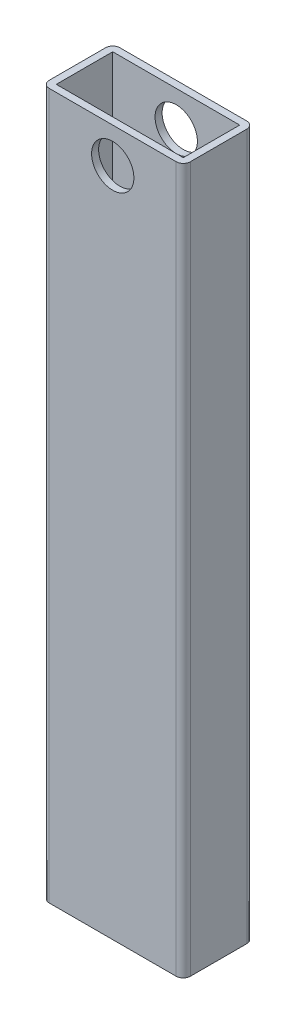
ISO-10303-21;
HEADER;
FILE_DESCRIPTION(('STEP AP214'),'2;1');
FILE_NAME('part.step','',(''),(''),'','','');
FILE_SCHEMA(('AUTOMOTIVE_DESIGN { 1 0 10303 214 1 1 1 1 }'));
ENDSEC;
DATA;
#1=APPLICATION_CONTEXT('core data for automotive mechanical design processes');
#2=APPLICATION_PROTOCOL_DEFINITION('international standard','automotive_design',2000,#1);
#3=PRODUCT_CONTEXT('',#1,'mechanical');
#4=PRODUCT('Part','Part','',(#3));
#5=PRODUCT_RELATED_PRODUCT_CATEGORY('part','',(#4));
#6=PRODUCT_DEFINITION_FORMATION('','',#4);
#7=PRODUCT_DEFINITION_CONTEXT('part definition',#1,'design');
#8=PRODUCT_DEFINITION('design','',#6,#7);
#9=PRODUCT_DEFINITION_SHAPE('','',#8);
#10=(LENGTH_UNIT() NAMED_UNIT(*) SI_UNIT(.MILLI.,.METRE.));
#11=(NAMED_UNIT(*) PLANE_ANGLE_UNIT() SI_UNIT($,.RADIAN.));
#12=(NAMED_UNIT(*) SI_UNIT($,.STERADIAN.) SOLID_ANGLE_UNIT());
#13=UNCERTAINTY_MEASURE_WITH_UNIT(LENGTH_MEASURE(1.E-05),#10,'distance_accuracy_value','');
#14=(GEOMETRIC_REPRESENTATION_CONTEXT(3) GLOBAL_UNCERTAINTY_ASSIGNED_CONTEXT((#13)) GLOBAL_UNIT_ASSIGNED_CONTEXT((#10,
#11,#12)) REPRESENTATION_CONTEXT('',''));
#15=CARTESIAN_POINT('',(0.,0.,0.));
#16=DIRECTION('',(0.,0.,1.));
#17=DIRECTION('',(1.,0.,0.));
#18=AXIS2_PLACEMENT_3D('',#15,#16,#17);
#19=CARTESIAN_POINT('',(10.,-100.,-5.));
#20=DIRECTION('',(1.,0.,0.));
#21=DIRECTION('',(0.,0.,-1.));
#22=AXIS2_PLACEMENT_3D('',#19,#20,#21);
#23=PLANE('',#22);
#24=DIRECTION('',(0.,0.,-1.));
#25=VECTOR('',#24,1.);
#26=CARTESIAN_POINT('',(10.,-100.,-5.));
#27=LINE('',#26,#25);
#28=CARTESIAN_POINT('',(10.,-100.,4.));
#29=VERTEX_POINT('',#28);
#30=CARTESIAN_POINT('',(10.,-100.,-4.));
#31=VERTEX_POINT('',#30);
#32=EDGE_CURVE('E194',#29,#31,#27,.T.);
#33=ORIENTED_EDGE('',*,*,#32,.T.);
#34=DIRECTION('',(0.,1.,0.));
#35=VECTOR('',#34,1.);
#36=CARTESIAN_POINT('',(10.,-100.,-4.));
#37=LINE('',#36,#35);
#38=CARTESIAN_POINT('',(10.,0.,-4.));
#39=VERTEX_POINT('',#38);
#40=EDGE_CURVE('E247',#31,#39,#37,.T.);
#41=ORIENTED_EDGE('',*,*,#40,.T.);
#42=DIRECTION('',(0.,0.,-1.));
#43=VECTOR('',#42,1.);
#44=CARTESIAN_POINT('',(10.,0.,-5.));
#45=LINE('',#44,#43);
#46=CARTESIAN_POINT('',(10.,0.,4.));
#47=VERTEX_POINT('',#46);
#48=EDGE_CURVE('E190',#47,#39,#45,.T.);
#49=ORIENTED_EDGE('',*,*,#48,.F.);
#50=DIRECTION('',(0.,1.,0.));
#51=VECTOR('',#50,1.);
#52=CARTESIAN_POINT('',(10.,-100.,4.));
#53=LINE('',#52,#51);
#54=EDGE_CURVE('E245',#47,#29,#53,.F.);
#55=ORIENTED_EDGE('',*,*,#54,.T.);
#56=EDGE_LOOP('',(#33,#41,#49,#55));
#57=FACE_BOUND('',#56,.T.);
#58=ADVANCED_FACE('F59',(#57),#23,.T.);
#59=CARTESIAN_POINT('',(-10.,-100.,5.));
#60=DIRECTION('',(0.,0.,1.));
#61=DIRECTION('',(1.,0.,0.));
#62=AXIS2_PLACEMENT_3D('',#59,#60,#61);
#63=PLANE('',#62);
#64=CARTESIAN_POINT('',(0.,-5.,5.));
#65=DIRECTION('',(0.,0.,1.));
#66=DIRECTION('',(1.,0.,0.));
#67=AXIS2_PLACEMENT_3D('',#64,#65,#66);
#68=CIRCLE('',#67,3.);
#69=CARTESIAN_POINT('',(3.,-5.,5.));
#70=VERTEX_POINT('',#69);
#71=EDGE_CURVE('E419',#70,#70,#68,.T.);
#72=ORIENTED_EDGE('',*,*,#71,.F.);
#73=EDGE_LOOP('',(#72));
#74=FACE_BOUND('',#73,.T.);
#75=DIRECTION('',(1.,0.,0.));
#76=VECTOR('',#75,1.);
#77=CARTESIAN_POINT('',(-10.,0.,5.));
#78=LINE('',#77,#76);
#79=CARTESIAN_POINT('',(-9.,0.,5.));
#80=VERTEX_POINT('',#79);
#81=CARTESIAN_POINT('',(9.,0.,5.));
#82=VERTEX_POINT('',#81);
#83=EDGE_CURVE('E198',#80,#82,#78,.T.);
#84=ORIENTED_EDGE('',*,*,#83,.F.);
#85=DIRECTION('',(0.,1.,0.));
#86=VECTOR('',#85,1.);
#87=CARTESIAN_POINT('',(-9.,-100.,5.));
#88=LINE('',#87,#86);
#89=CARTESIAN_POINT('',(-9.,-100.,5.));
#90=VERTEX_POINT('',#89);
#91=EDGE_CURVE('E12',#80,#90,#88,.F.);
#92=ORIENTED_EDGE('',*,*,#91,.T.);
#93=DIRECTION('',(1.,0.,0.));
#94=VECTOR('',#93,1.);
#95=CARTESIAN_POINT('',(-10.,-100.,5.));
#96=LINE('',#95,#94);
#97=CARTESIAN_POINT('',(9.,-100.,5.));
#98=VERTEX_POINT('',#97);
#99=EDGE_CURVE('E204',#90,#98,#96,.T.);
#100=ORIENTED_EDGE('',*,*,#99,.T.);
#101=DIRECTION('',(0.,1.,0.));
#102=VECTOR('',#101,1.);
#103=CARTESIAN_POINT('',(9.,-100.,5.));
#104=LINE('',#103,#102);
#105=EDGE_CURVE('E67',#98,#82,#104,.T.);
#106=ORIENTED_EDGE('',*,*,#105,.T.);
#107=EDGE_LOOP('',(#84,#92,#100,#106));
#108=FACE_BOUND('',#107,.T.);
#109=ADVANCED_FACE('F251',(#74,#108),#63,.T.);
#110=CARTESIAN_POINT('',(-10.,-100.,-5.));
#111=DIRECTION('',(-1.,0.,0.));
#112=DIRECTION('',(0.,0.,1.));
#113=AXIS2_PLACEMENT_3D('',#110,#111,#112);
#114=PLANE('',#113);
#115=DIRECTION('',(0.,0.,1.));
#116=VECTOR('',#115,1.);
#117=CARTESIAN_POINT('',(-10.,0.,-5.));
#118=LINE('',#117,#116);
#119=CARTESIAN_POINT('',(-10.,0.,-4.));
#120=VERTEX_POINT('',#119);
#121=CARTESIAN_POINT('',(-10.,0.,4.));
#122=VERTEX_POINT('',#121);
#123=EDGE_CURVE('E212',#120,#122,#118,.T.);
#124=ORIENTED_EDGE('',*,*,#123,.F.);
#125=DIRECTION('',(0.,1.,0.));
#126=VECTOR('',#125,1.);
#127=CARTESIAN_POINT('',(-10.,-100.,-4.));
#128=LINE('',#127,#126);
#129=CARTESIAN_POINT('',(-10.,-100.,-4.));
#130=VERTEX_POINT('',#129);
#131=EDGE_CURVE('E236',#120,#130,#128,.F.);
#132=ORIENTED_EDGE('',*,*,#131,.T.);
#133=DIRECTION('',(0.,0.,1.));
#134=VECTOR('',#133,1.);
#135=CARTESIAN_POINT('',(-10.,-100.,-5.));
#136=LINE('',#135,#134);
#137=CARTESIAN_POINT('',(-10.,-100.,4.));
#138=VERTEX_POINT('',#137);
#139=EDGE_CURVE('E201',#130,#138,#136,.T.);
#140=ORIENTED_EDGE('',*,*,#139,.T.);
#141=DIRECTION('',(0.,1.,0.));
#142=VECTOR('',#141,1.);
#143=CARTESIAN_POINT('',(-10.,-100.,4.));
#144=LINE('',#143,#142);
#145=EDGE_CURVE('E233',#138,#122,#144,.T.);
#146=ORIENTED_EDGE('',*,*,#145,.T.);
#147=EDGE_LOOP('',(#124,#132,#140,#146));
#148=FACE_BOUND('',#147,.T.);
#149=ADVANCED_FACE('F262',(#148),#114,.T.);
#150=CARTESIAN_POINT('',(-10.,-100.,-5.));
#151=DIRECTION('',(0.,0.,-1.));
#152=DIRECTION('',(-1.,0.,0.));
#153=AXIS2_PLACEMENT_3D('',#150,#151,#152);
#154=PLANE('',#153);
#155=CARTESIAN_POINT('',(0.,-5.,-5.));
#156=DIRECTION('',(0.,0.,1.));
#157=DIRECTION('',(1.,0.,0.));
#158=AXIS2_PLACEMENT_3D('',#155,#156,#157);
#159=CIRCLE('',#158,3.);
#160=CARTESIAN_POINT('',(3.,-5.,-5.));
#161=VERTEX_POINT('',#160);
#162=EDGE_CURVE('E220',#161,#161,#159,.T.);
#163=ORIENTED_EDGE('',*,*,#162,.T.);
#164=EDGE_LOOP('',(#163));
#165=FACE_BOUND('',#164,.T.);
#166=DIRECTION('',(-1.,0.,0.));
#167=VECTOR('',#166,1.);
#168=CARTESIAN_POINT('',(-10.,-100.,-5.));
#169=LINE('',#168,#167);
#170=CARTESIAN_POINT('',(9.,-100.,-5.));
#171=VERTEX_POINT('',#170);
#172=CARTESIAN_POINT('',(-9.,-100.,-5.));
#173=VERTEX_POINT('',#172);
#174=EDGE_CURVE('E197',#171,#173,#169,.T.);
#175=ORIENTED_EDGE('',*,*,#174,.T.);
#176=DIRECTION('',(0.,1.,0.));
#177=VECTOR('',#176,1.);
#178=CARTESIAN_POINT('',(-9.,-100.,-5.));
#179=LINE('',#178,#177);
#180=CARTESIAN_POINT('',(-9.,0.,-5.));
#181=VERTEX_POINT('',#180);
#182=EDGE_CURVE('E222',#173,#181,#179,.T.);
#183=ORIENTED_EDGE('',*,*,#182,.T.);
#184=DIRECTION('',(-1.,0.,0.));
#185=VECTOR('',#184,1.);
#186=CARTESIAN_POINT('',(-10.,0.,-5.));
#187=LINE('',#186,#185);
#188=CARTESIAN_POINT('',(9.,0.,-5.));
#189=VERTEX_POINT('',#188);
#190=EDGE_CURVE('E209',#189,#181,#187,.T.);
#191=ORIENTED_EDGE('',*,*,#190,.F.);
#192=DIRECTION('',(0.,1.,0.));
#193=VECTOR('',#192,1.);
#194=CARTESIAN_POINT('',(9.,-100.,-5.));
#195=LINE('',#194,#193);
#196=EDGE_CURVE('E206',#189,#171,#195,.F.);
#197=ORIENTED_EDGE('',*,*,#196,.T.);
#198=EDGE_LOOP('',(#175,#183,#191,#197));
#199=FACE_BOUND('',#198,.T.);
#200=ADVANCED_FACE('F272',(#165,#199),#154,.T.);
#201=CARTESIAN_POINT('',(0.,-100.,0.));
#202=DIRECTION('',(0.,1.,0.));
#203=DIRECTION('',(0.,0.,1.));
#204=AXIS2_PLACEMENT_3D('',#201,#202,#203);
#205=PLANE('',#204);
#206=DIRECTION('',(1.,0.,0.));
#207=VECTOR('',#206,1.);
#208=CARTESIAN_POINT('',(-10.,-100.,4.));
#209=LINE('',#208,#207);
#210=CARTESIAN_POINT('',(-9.,-100.,4.));
#211=VERTEX_POINT('',#210);
#212=CARTESIAN_POINT('',(9.,-100.,4.));
#213=VERTEX_POINT('',#212);
#214=EDGE_CURVE('E160',#211,#213,#209,.T.);
#215=ORIENTED_EDGE('',*,*,#214,.T.);
#216=DIRECTION('',(0.,0.,-1.));
#217=VECTOR('',#216,1.);
#218=CARTESIAN_POINT('',(9.,-100.,-5.));
#219=LINE('',#218,#217);
#220=CARTESIAN_POINT('',(9.,-100.,-4.));
#221=VERTEX_POINT('',#220);
#222=EDGE_CURVE('E152',#213,#221,#219,.T.);
#223=ORIENTED_EDGE('',*,*,#222,.T.);
#224=DIRECTION('',(-1.,0.,0.));
#225=VECTOR('',#224,1.);
#226=CARTESIAN_POINT('',(-10.,-100.,-4.));
#227=LINE('',#226,#225);
#228=CARTESIAN_POINT('',(-9.,-100.,-4.));
#229=VERTEX_POINT('',#228);
#230=EDGE_CURVE('E164',#221,#229,#227,.T.);
#231=ORIENTED_EDGE('',*,*,#230,.T.);
#232=DIRECTION('',(0.,0.,1.));
#233=VECTOR('',#232,1.);
#234=CARTESIAN_POINT('',(-9.,-100.,-5.));
#235=LINE('',#234,#233);
#236=EDGE_CURVE('E168',#229,#211,#235,.T.);
#237=ORIENTED_EDGE('',*,*,#236,.T.);
#238=EDGE_LOOP('',(#215,#223,#231,#237));
#239=FACE_BOUND('',#238,.T.);
#240=ORIENTED_EDGE('',*,*,#139,.F.);
#241=CARTESIAN_POINT('',(-9.,-100.,-4.));
#242=DIRECTION('',(0.,1.,0.));
#243=DIRECTION('',(0.,0.,1.));
#244=AXIS2_PLACEMENT_3D('',#241,#242,#243);
#245=CIRCLE('',#244,1.);
#246=EDGE_CURVE('E243',#130,#173,#245,.F.);
#247=ORIENTED_EDGE('',*,*,#246,.T.);
#248=ORIENTED_EDGE('',*,*,#174,.F.);
#249=CARTESIAN_POINT('',(9.,-100.,-4.));
#250=DIRECTION('',(0.,1.,0.));
#251=DIRECTION('',(0.,0.,1.));
#252=AXIS2_PLACEMENT_3D('',#249,#250,#251);
#253=CIRCLE('',#252,1.);
#254=EDGE_CURVE('E241',#171,#31,#253,.F.);
#255=ORIENTED_EDGE('',*,*,#254,.T.);
#256=ORIENTED_EDGE('',*,*,#32,.F.);
#257=CARTESIAN_POINT('',(9.,-100.,4.));
#258=DIRECTION('',(0.,1.,0.));
#259=DIRECTION('',(0.,0.,1.));
#260=AXIS2_PLACEMENT_3D('',#257,#258,#259);
#261=CIRCLE('',#260,1.);
#262=EDGE_CURVE('E74',#29,#98,#261,.F.);
#263=ORIENTED_EDGE('',*,*,#262,.T.);
#264=ORIENTED_EDGE('',*,*,#99,.F.);
#265=CARTESIAN_POINT('',(-9.,-100.,4.));
#266=DIRECTION('',(0.,1.,0.));
#267=DIRECTION('',(0.,0.,1.));
#268=AXIS2_PLACEMENT_3D('',#265,#266,#267);
#269=CIRCLE('',#268,1.);
#270=EDGE_CURVE('E239',#90,#138,#269,.F.);
#271=ORIENTED_EDGE('',*,*,#270,.T.);
#272=EDGE_LOOP('',(#240,#247,#248,#255,#256,#263,#264,#271));
#273=FACE_BOUND('',#272,.T.);
#274=ADVANCED_FACE('F170',(#239,#273),#205,.F.);
#275=CARTESIAN_POINT('',(0.,0.,0.));
#276=DIRECTION('',(0.,1.,0.));
#277=DIRECTION('',(0.,0.,1.));
#278=AXIS2_PLACEMENT_3D('',#275,#276,#277);
#279=PLANE('',#278);
#280=DIRECTION('',(0.,0.,-1.));
#281=VECTOR('',#280,1.);
#282=CARTESIAN_POINT('',(9.,0.,-5.));
#283=LINE('',#282,#281);
#284=CARTESIAN_POINT('',(9.,0.,4.));
#285=VERTEX_POINT('',#284);
#286=CARTESIAN_POINT('',(9.,0.,-4.));
#287=VERTEX_POINT('',#286);
#288=EDGE_CURVE('E155',#285,#287,#283,.T.);
#289=ORIENTED_EDGE('',*,*,#288,.F.);
#290=DIRECTION('',(1.,0.,0.));
#291=VECTOR('',#290,1.);
#292=CARTESIAN_POINT('',(-10.,0.,4.));
#293=LINE('',#292,#291);
#294=CARTESIAN_POINT('',(-9.,0.,4.));
#295=VERTEX_POINT('',#294);
#296=EDGE_CURVE('E172',#295,#285,#293,.T.);
#297=ORIENTED_EDGE('',*,*,#296,.F.);
#298=DIRECTION('',(0.,0.,1.));
#299=VECTOR('',#298,1.);
#300=CARTESIAN_POINT('',(-9.,0.,-5.));
#301=LINE('',#300,#299);
#302=CARTESIAN_POINT('',(-9.,0.,-4.));
#303=VERTEX_POINT('',#302);
#304=EDGE_CURVE('E175',#303,#295,#301,.T.);
#305=ORIENTED_EDGE('',*,*,#304,.F.);
#306=DIRECTION('',(-1.,0.,0.));
#307=VECTOR('',#306,1.);
#308=CARTESIAN_POINT('',(-10.,0.,-4.));
#309=LINE('',#308,#307);
#310=EDGE_CURVE('E184',#287,#303,#309,.T.);
#311=ORIENTED_EDGE('',*,*,#310,.F.);
#312=EDGE_LOOP('',(#289,#297,#305,#311));
#313=FACE_BOUND('',#312,.T.);
#314=ORIENTED_EDGE('',*,*,#190,.T.);
#315=CARTESIAN_POINT('',(-9.,0.,-4.));
#316=DIRECTION('',(0.,1.,0.));
#317=DIRECTION('',(0.,0.,1.));
#318=AXIS2_PLACEMENT_3D('',#315,#316,#317);
#319=CIRCLE('',#318,1.);
#320=EDGE_CURVE('E231',#181,#120,#319,.T.);
#321=ORIENTED_EDGE('',*,*,#320,.T.);
#322=ORIENTED_EDGE('',*,*,#123,.T.);
#323=CARTESIAN_POINT('',(-9.,0.,4.));
#324=DIRECTION('',(0.,1.,0.));
#325=DIRECTION('',(0.,0.,1.));
#326=AXIS2_PLACEMENT_3D('',#323,#324,#325);
#327=CIRCLE('',#326,1.);
#328=EDGE_CURVE('E227',#122,#80,#327,.T.);
#329=ORIENTED_EDGE('',*,*,#328,.T.);
#330=ORIENTED_EDGE('',*,*,#83,.T.);
#331=CARTESIAN_POINT('',(9.,0.,4.));
#332=DIRECTION('',(0.,1.,0.));
#333=DIRECTION('',(0.,0.,1.));
#334=AXIS2_PLACEMENT_3D('',#331,#332,#333);
#335=CIRCLE('',#334,1.);
#336=EDGE_CURVE('E225',#82,#47,#335,.T.);
#337=ORIENTED_EDGE('',*,*,#336,.T.);
#338=ORIENTED_EDGE('',*,*,#48,.T.);
#339=CARTESIAN_POINT('',(9.,0.,-4.));
#340=DIRECTION('',(0.,1.,0.));
#341=DIRECTION('',(0.,0.,1.));
#342=AXIS2_PLACEMENT_3D('',#339,#340,#341);
#343=CIRCLE('',#342,1.);
#344=EDGE_CURVE('E229',#39,#189,#343,.T.);
#345=ORIENTED_EDGE('',*,*,#344,.T.);
#346=EDGE_LOOP('',(#314,#321,#322,#329,#330,#337,#338,#345));
#347=FACE_BOUND('',#346,.T.);
#348=ADVANCED_FACE('F254',(#313,#347),#279,.T.);
#349=CARTESIAN_POINT('',(9.,-100.,-5.));
#350=DIRECTION('',(1.,0.,0.));
#351=DIRECTION('',(0.,0.,-1.));
#352=AXIS2_PLACEMENT_3D('',#349,#350,#351);
#353=PLANE('',#352);
#354=ORIENTED_EDGE('',*,*,#288,.T.);
#355=DIRECTION('',(0.,1.,0.));
#356=VECTOR('',#355,1.);
#357=CARTESIAN_POINT('',(9.,-100.,-4.));
#358=LINE('',#357,#356);
#359=EDGE_CURVE('E148',#221,#287,#358,.T.);
#360=ORIENTED_EDGE('',*,*,#359,.F.);
#361=ORIENTED_EDGE('',*,*,#222,.F.);
#362=DIRECTION('',(0.,1.,0.));
#363=VECTOR('',#362,1.);
#364=CARTESIAN_POINT('',(9.,-100.,4.));
#365=LINE('',#364,#363);
#366=EDGE_CURVE('E188',#213,#285,#365,.T.);
#367=ORIENTED_EDGE('',*,*,#366,.T.);
#368=EDGE_LOOP('',(#354,#360,#361,#367));
#369=FACE_BOUND('',#368,.T.);
#370=ADVANCED_FACE('F150',(#369),#353,.F.);
#371=CARTESIAN_POINT('',(-10.,-100.,4.));
#372=DIRECTION('',(0.,0.,1.));
#373=DIRECTION('',(1.,0.,0.));
#374=AXIS2_PLACEMENT_3D('',#371,#372,#373);
#375=PLANE('',#374);
#376=CARTESIAN_POINT('',(0.,-5.,4.));
#377=DIRECTION('',(0.,0.,1.));
#378=DIRECTION('',(1.,0.,0.));
#379=AXIS2_PLACEMENT_3D('',#376,#377,#378);
#380=CIRCLE('',#379,3.);
#381=CARTESIAN_POINT('',(3.,-5.,4.));
#382=VERTEX_POINT('',#381);
#383=EDGE_CURVE('E178',#382,#382,#380,.T.);
#384=ORIENTED_EDGE('',*,*,#383,.T.);
#385=EDGE_LOOP('',(#384));
#386=FACE_BOUND('',#385,.T.);
#387=ORIENTED_EDGE('',*,*,#296,.T.);
#388=ORIENTED_EDGE('',*,*,#366,.F.);
#389=ORIENTED_EDGE('',*,*,#214,.F.);
#390=DIRECTION('',(0.,1.,0.));
#391=VECTOR('',#390,1.);
#392=CARTESIAN_POINT('',(-9.,-100.,4.));
#393=LINE('',#392,#391);
#394=EDGE_CURVE('E191',#211,#295,#393,.T.);
#395=ORIENTED_EDGE('',*,*,#394,.T.);
#396=EDGE_LOOP('',(#387,#388,#389,#395));
#397=FACE_BOUND('',#396,.T.);
#398=ADVANCED_FACE('F353',(#386,#397),#375,.F.);
#399=CARTESIAN_POINT('',(-9.,-100.,-5.));
#400=DIRECTION('',(-1.,0.,0.));
#401=DIRECTION('',(0.,0.,1.));
#402=AXIS2_PLACEMENT_3D('',#399,#400,#401);
#403=PLANE('',#402);
#404=ORIENTED_EDGE('',*,*,#304,.T.);
#405=ORIENTED_EDGE('',*,*,#394,.F.);
#406=ORIENTED_EDGE('',*,*,#236,.F.);
#407=DIRECTION('',(0.,1.,0.));
#408=VECTOR('',#407,1.);
#409=CARTESIAN_POINT('',(-9.,-100.,-4.));
#410=LINE('',#409,#408);
#411=EDGE_CURVE('E159',#229,#303,#410,.T.);
#412=ORIENTED_EDGE('',*,*,#411,.T.);
#413=EDGE_LOOP('',(#404,#405,#406,#412));
#414=FACE_BOUND('',#413,.T.);
#415=ADVANCED_FACE('F343',(#414),#403,.F.);
#416=CARTESIAN_POINT('',(-10.,-100.,-4.));
#417=DIRECTION('',(0.,0.,-1.));
#418=DIRECTION('',(-1.,0.,0.));
#419=AXIS2_PLACEMENT_3D('',#416,#417,#418);
#420=PLANE('',#419);
#421=CARTESIAN_POINT('',(0.,-5.,-4.));
#422=DIRECTION('',(0.,0.,-1.));
#423=DIRECTION('',(-1.,0.,0.));
#424=AXIS2_PLACEMENT_3D('',#421,#422,#423);
#425=CIRCLE('',#424,3.);
#426=CARTESIAN_POINT('',(-3.,-5.,-4.));
#427=VERTEX_POINT('',#426);
#428=EDGE_CURVE('E217',#427,#427,#425,.T.);
#429=ORIENTED_EDGE('',*,*,#428,.T.);
#430=EDGE_LOOP('',(#429));
#431=FACE_BOUND('',#430,.T.);
#432=ORIENTED_EDGE('',*,*,#310,.T.);
#433=ORIENTED_EDGE('',*,*,#411,.F.);
#434=ORIENTED_EDGE('',*,*,#230,.F.);
#435=ORIENTED_EDGE('',*,*,#359,.T.);
#436=EDGE_LOOP('',(#432,#433,#434,#435));
#437=FACE_BOUND('',#436,.T.);
#438=ADVANCED_FACE('F165',(#431,#437),#420,.F.);
#439=CARTESIAN_POINT('',(0.,-5.,-5.));
#440=DIRECTION('',(0.,0.,1.));
#441=DIRECTION('',(1.,0.,0.));
#442=AXIS2_PLACEMENT_3D('',#439,#440,#441);
#443=CYLINDRICAL_SURFACE('',#442,3.);
#444=ORIENTED_EDGE('',*,*,#162,.F.);
#445=EDGE_LOOP('',(#444));
#446=FACE_BOUND('',#445,.T.);
#447=ORIENTED_EDGE('',*,*,#428,.F.);
#448=EDGE_LOOP('',(#447));
#449=FACE_BOUND('',#448,.T.);
#450=ADVANCED_FACE('F327',(#446,#449),#443,.F.);
#451=ORIENTED_EDGE('',*,*,#71,.T.);
#452=EDGE_LOOP('',(#451));
#453=FACE_BOUND('',#452,.T.);
#454=ORIENTED_EDGE('',*,*,#383,.F.);
#455=EDGE_LOOP('',(#454));
#456=FACE_BOUND('',#455,.T.);
#457=ADVANCED_FACE('F296',(#453,#456),#443,.F.);
#458=CARTESIAN_POINT('',(-9.,-100.,-4.));
#459=DIRECTION('',(0.,1.,0.));
#460=DIRECTION('',(0.,0.,1.));
#461=AXIS2_PLACEMENT_3D('',#458,#459,#460);
#462=CYLINDRICAL_SURFACE('',#461,1.);
#463=ORIENTED_EDGE('',*,*,#246,.F.);
#464=ORIENTED_EDGE('',*,*,#131,.F.);
#465=ORIENTED_EDGE('',*,*,#320,.F.);
#466=ORIENTED_EDGE('',*,*,#182,.F.);
#467=EDGE_LOOP('',(#463,#464,#465,#466));
#468=FACE_BOUND('',#467,.T.);
#469=ADVANCED_FACE('F269',(#468),#462,.T.);
#470=CARTESIAN_POINT('',(9.,-100.,-4.));
#471=DIRECTION('',(0.,1.,0.));
#472=DIRECTION('',(0.,0.,1.));
#473=AXIS2_PLACEMENT_3D('',#470,#471,#472);
#474=CYLINDRICAL_SURFACE('',#473,1.);
#475=ORIENTED_EDGE('',*,*,#254,.F.);
#476=ORIENTED_EDGE('',*,*,#196,.F.);
#477=ORIENTED_EDGE('',*,*,#344,.F.);
#478=ORIENTED_EDGE('',*,*,#40,.F.);
#479=EDGE_LOOP('',(#475,#476,#477,#478));
#480=FACE_BOUND('',#479,.T.);
#481=ADVANCED_FACE('F277',(#480),#474,.T.);
#482=CARTESIAN_POINT('',(-9.,-100.,4.));
#483=DIRECTION('',(0.,1.,0.));
#484=DIRECTION('',(0.,0.,1.));
#485=AXIS2_PLACEMENT_3D('',#482,#483,#484);
#486=CYLINDRICAL_SURFACE('',#485,1.);
#487=ORIENTED_EDGE('',*,*,#270,.F.);
#488=ORIENTED_EDGE('',*,*,#91,.F.);
#489=ORIENTED_EDGE('',*,*,#328,.F.);
#490=ORIENTED_EDGE('',*,*,#145,.F.);
#491=EDGE_LOOP('',(#487,#488,#489,#490));
#492=FACE_BOUND('',#491,.T.);
#493=ADVANCED_FACE('F260',(#492),#486,.T.);
#494=CARTESIAN_POINT('',(9.,-100.,4.));
#495=DIRECTION('',(0.,1.,0.));
#496=DIRECTION('',(0.,0.,1.));
#497=AXIS2_PLACEMENT_3D('',#494,#495,#496);
#498=CYLINDRICAL_SURFACE('',#497,1.);
#499=ORIENTED_EDGE('',*,*,#262,.F.);
#500=ORIENTED_EDGE('',*,*,#54,.F.);
#501=ORIENTED_EDGE('',*,*,#336,.F.);
#502=ORIENTED_EDGE('',*,*,#105,.F.);
#503=EDGE_LOOP('',(#499,#500,#501,#502));
#504=FACE_BOUND('',#503,.T.);
#505=ADVANCED_FACE('F61',(#504),#498,.T.);
#506=CLOSED_SHELL('',(#58,#109,#149,#200,#274,#348,#370,#398,#415,#438,#450,#457,#469,#481,#493,#505));
#507=MANIFOLD_SOLID_BREP('B2',#506);
#508=ADVANCED_BREP_SHAPE_REPRESENTATION('',(#18,#507),#14);
#509=SHAPE_DEFINITION_REPRESENTATION(#9,#508);
ENDSEC;
END-ISO-10303-21;
